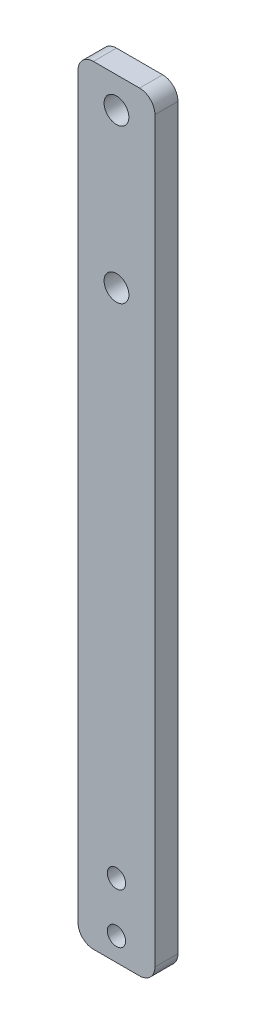
ISO-10303-21;
HEADER;
FILE_DESCRIPTION(('STEP AP214'),'2;1');
FILE_NAME('part.step','',(''),(''),'','','');
FILE_SCHEMA(('AUTOMOTIVE_DESIGN { 1 0 10303 214 1 1 1 1 }'));
ENDSEC;
DATA;
#1=APPLICATION_CONTEXT('core data for automotive mechanical design processes');
#2=APPLICATION_PROTOCOL_DEFINITION('international standard','automotive_design',2000,#1);
#3=PRODUCT_CONTEXT('',#1,'mechanical');
#4=PRODUCT('Part','Part','',(#3));
#5=PRODUCT_RELATED_PRODUCT_CATEGORY('part','',(#4));
#6=PRODUCT_DEFINITION_FORMATION('','',#4);
#7=PRODUCT_DEFINITION_CONTEXT('part definition',#1,'design');
#8=PRODUCT_DEFINITION('design','',#6,#7);
#9=PRODUCT_DEFINITION_SHAPE('','',#8);
#10=(LENGTH_UNIT() NAMED_UNIT(*) SI_UNIT(.MILLI.,.METRE.));
#11=(NAMED_UNIT(*) PLANE_ANGLE_UNIT() SI_UNIT($,.RADIAN.));
#12=(NAMED_UNIT(*) SI_UNIT($,.STERADIAN.) SOLID_ANGLE_UNIT());
#13=UNCERTAINTY_MEASURE_WITH_UNIT(LENGTH_MEASURE(1.E-05),#10,'distance_accuracy_value','');
#14=(GEOMETRIC_REPRESENTATION_CONTEXT(3) GLOBAL_UNCERTAINTY_ASSIGNED_CONTEXT((#13)) GLOBAL_UNIT_ASSIGNED_CONTEXT((#10,
#11,#12)) REPRESENTATION_CONTEXT('',''));
#15=CARTESIAN_POINT('',(0.,0.,0.));
#16=DIRECTION('',(0.,0.,1.));
#17=DIRECTION('',(1.,0.,0.));
#18=AXIS2_PLACEMENT_3D('',#15,#16,#17);
#19=CARTESIAN_POINT('',(0.,0.,1.5));
#20=DIRECTION('',(0.,0.,1.));
#21=DIRECTION('',(1.,0.,0.));
#22=AXIS2_PLACEMENT_3D('',#19,#20,#21);
#23=PLANE('',#22);
#24=CARTESIAN_POINT('',(0.,44.875,1.5));
#25=DIRECTION('',(0.,0.,1.));
#26=DIRECTION('',(1.,0.,0.));
#27=AXIS2_PLACEMENT_3D('',#24,#25,#26);
#28=CIRCLE('',#27,0.806449999999999);
#29=CARTESIAN_POINT('',(0.806449999999999,44.875,1.5));
#30=VERTEX_POINT('',#29);
#31=EDGE_CURVE('E194',#30,#30,#28,.T.);
#32=ORIENTED_EDGE('',*,*,#31,.F.);
#33=EDGE_LOOP('',(#32));
#34=FACE_BOUND('',#33,.T.);
#35=CARTESIAN_POINT('',(0.,1.625,1.5));
#36=DIRECTION('',(0.,0.,1.));
#37=DIRECTION('',(1.,0.,0.));
#38=AXIS2_PLACEMENT_3D('',#35,#36,#37);
#39=CIRCLE('',#38,0.59563);
#40=CARTESIAN_POINT('',(0.595629999999999,1.625,1.5));
#41=VERTEX_POINT('',#40);
#42=EDGE_CURVE('E180',#41,#41,#39,.T.);
#43=ORIENTED_EDGE('',*,*,#42,.F.);
#44=EDGE_LOOP('',(#43));
#45=FACE_BOUND('',#44,.T.);
#46=DIRECTION('',(-1.,0.,0.));
#47=VECTOR('',#46,1.);
#48=CARTESIAN_POINT('',(2.5,46.875,1.5));
#49=LINE('',#48,#47);
#50=CARTESIAN_POINT('',(1.5,46.875,1.5));
#51=VERTEX_POINT('',#50);
#52=CARTESIAN_POINT('',(-1.5,46.875,1.5));
#53=VERTEX_POINT('',#52);
#54=EDGE_CURVE('E174',#51,#53,#49,.T.);
#55=ORIENTED_EDGE('',*,*,#54,.T.);
#56=CARTESIAN_POINT('',(-1.5,45.875,1.5));
#57=DIRECTION('',(0.,0.,1.));
#58=DIRECTION('',(1.,0.,0.));
#59=AXIS2_PLACEMENT_3D('',#56,#57,#58);
#60=CIRCLE('',#59,1.);
#61=CARTESIAN_POINT('',(-2.5,45.875,1.5));
#62=VERTEX_POINT('',#61);
#63=EDGE_CURVE('E154',#53,#62,#60,.T.);
#64=ORIENTED_EDGE('',*,*,#63,.T.);
#65=DIRECTION('',(0.,-1.,0.));
#66=VECTOR('',#65,1.);
#67=CARTESIAN_POINT('',(-2.5,-3.125,1.5));
#68=LINE('',#67,#66);
#69=CARTESIAN_POINT('',(-2.5,-2.125,1.5));
#70=VERTEX_POINT('',#69);
#71=EDGE_CURVE('E124',#62,#70,#68,.T.);
#72=ORIENTED_EDGE('',*,*,#71,.T.);
#73=CARTESIAN_POINT('',(-1.5,-2.125,1.5));
#74=DIRECTION('',(0.,0.,1.));
#75=DIRECTION('',(1.,0.,0.));
#76=AXIS2_PLACEMENT_3D('',#73,#74,#75);
#77=CIRCLE('',#76,1.);
#78=CARTESIAN_POINT('',(-1.5,-3.125,1.5));
#79=VERTEX_POINT('',#78);
#80=EDGE_CURVE('E60',#70,#79,#77,.T.);
#81=ORIENTED_EDGE('',*,*,#80,.T.);
#82=DIRECTION('',(1.,0.,0.));
#83=VECTOR('',#82,1.);
#84=CARTESIAN_POINT('',(2.5,-3.125,1.5));
#85=LINE('',#84,#83);
#86=CARTESIAN_POINT('',(1.5,-3.125,1.5));
#87=VERTEX_POINT('',#86);
#88=EDGE_CURVE('E141',#79,#87,#85,.T.);
#89=ORIENTED_EDGE('',*,*,#88,.T.);
#90=CARTESIAN_POINT('',(1.5,-2.125,1.5));
#91=DIRECTION('',(0.,0.,1.));
#92=DIRECTION('',(1.,0.,0.));
#93=AXIS2_PLACEMENT_3D('',#90,#91,#92);
#94=CIRCLE('',#93,1.);
#95=CARTESIAN_POINT('',(2.5,-2.125,1.5));
#96=VERTEX_POINT('',#95);
#97=EDGE_CURVE('E149',#87,#96,#94,.T.);
#98=ORIENTED_EDGE('',*,*,#97,.T.);
#99=DIRECTION('',(0.,1.,0.));
#100=VECTOR('',#99,1.);
#101=CARTESIAN_POINT('',(2.5,-3.125,1.5));
#102=LINE('',#101,#100);
#103=CARTESIAN_POINT('',(2.5,45.875,1.5));
#104=VERTEX_POINT('',#103);
#105=EDGE_CURVE('E135',#96,#104,#102,.T.);
#106=ORIENTED_EDGE('',*,*,#105,.T.);
#107=CARTESIAN_POINT('',(1.5,45.875,1.5));
#108=DIRECTION('',(0.,0.,1.));
#109=DIRECTION('',(1.,0.,0.));
#110=AXIS2_PLACEMENT_3D('',#107,#108,#109);
#111=CIRCLE('',#110,1.);
#112=EDGE_CURVE('E152',#104,#51,#111,.T.);
#113=ORIENTED_EDGE('',*,*,#112,.T.);
#114=EDGE_LOOP('',(#55,#64,#72,#81,#89,#98,#106,#113));
#115=FACE_BOUND('',#114,.T.);
#116=CARTESIAN_POINT('',(0.,-1.625,1.5));
#117=DIRECTION('',(0.,0.,1.));
#118=DIRECTION('',(1.,0.,0.));
#119=AXIS2_PLACEMENT_3D('',#116,#117,#118);
#120=CIRCLE('',#119,0.59563);
#121=CARTESIAN_POINT('',(0.59563,-1.625,1.5));
#122=VERTEX_POINT('',#121);
#123=EDGE_CURVE('E189',#122,#122,#120,.T.);
#124=ORIENTED_EDGE('',*,*,#123,.F.);
#125=EDGE_LOOP('',(#124));
#126=FACE_BOUND('',#125,.T.);
#127=CARTESIAN_POINT('',(0.,34.875,1.5));
#128=DIRECTION('',(0.,0.,1.));
#129=DIRECTION('',(1.,0.,0.));
#130=AXIS2_PLACEMENT_3D('',#127,#128,#129);
#131=CIRCLE('',#130,0.80645);
#132=CARTESIAN_POINT('',(0.80645,34.875,1.5));
#133=VERTEX_POINT('',#132);
#134=EDGE_CURVE('E200',#133,#133,#131,.T.);
#135=ORIENTED_EDGE('',*,*,#134,.F.);
#136=EDGE_LOOP('',(#135));
#137=FACE_BOUND('',#136,.T.);
#138=ADVANCED_FACE('F39',(#34,#45,#115,#126,#137),#23,.T.);
#139=CARTESIAN_POINT('',(0.,0.,0.));
#140=DIRECTION('',(0.,0.,1.));
#141=DIRECTION('',(1.,0.,0.));
#142=AXIS2_PLACEMENT_3D('',#139,#140,#141);
#143=PLANE('',#142);
#144=DIRECTION('',(0.,-1.,0.));
#145=VECTOR('',#144,1.);
#146=CARTESIAN_POINT('',(-2.5,-3.125,0.));
#147=LINE('',#146,#145);
#148=CARTESIAN_POINT('',(-2.5,45.875,0.));
#149=VERTEX_POINT('',#148);
#150=CARTESIAN_POINT('',(-2.5,-2.125,0.));
#151=VERTEX_POINT('',#150);
#152=EDGE_CURVE('E122',#149,#151,#147,.T.);
#153=ORIENTED_EDGE('',*,*,#152,.F.);
#154=CARTESIAN_POINT('',(-1.5,45.875,0.));
#155=DIRECTION('',(0.,0.,1.));
#156=DIRECTION('',(1.,0.,0.));
#157=AXIS2_PLACEMENT_3D('',#154,#155,#156);
#158=CIRCLE('',#157,1.);
#159=CARTESIAN_POINT('',(-1.5,46.875,0.));
#160=VERTEX_POINT('',#159);
#161=EDGE_CURVE('E105',#149,#160,#158,.F.);
#162=ORIENTED_EDGE('',*,*,#161,.T.);
#163=DIRECTION('',(-1.,0.,0.));
#164=VECTOR('',#163,1.);
#165=CARTESIAN_POINT('',(2.5,46.875,0.));
#166=LINE('',#165,#164);
#167=CARTESIAN_POINT('',(1.5,46.875,0.));
#168=VERTEX_POINT('',#167);
#169=EDGE_CURVE('E133',#168,#160,#166,.T.);
#170=ORIENTED_EDGE('',*,*,#169,.F.);
#171=CARTESIAN_POINT('',(1.5,45.875,0.));
#172=DIRECTION('',(0.,0.,1.));
#173=DIRECTION('',(1.,0.,0.));
#174=AXIS2_PLACEMENT_3D('',#171,#172,#173);
#175=CIRCLE('',#174,1.);
#176=CARTESIAN_POINT('',(2.5,45.875,0.));
#177=VERTEX_POINT('',#176);
#178=EDGE_CURVE('E116',#168,#177,#175,.F.);
#179=ORIENTED_EDGE('',*,*,#178,.T.);
#180=DIRECTION('',(0.,1.,0.));
#181=VECTOR('',#180,1.);
#182=CARTESIAN_POINT('',(2.5,-3.125,0.));
#183=LINE('',#182,#181);
#184=CARTESIAN_POINT('',(2.5,-2.125,0.));
#185=VERTEX_POINT('',#184);
#186=EDGE_CURVE('E137',#185,#177,#183,.T.);
#187=ORIENTED_EDGE('',*,*,#186,.F.);
#188=CARTESIAN_POINT('',(1.5,-2.125,0.));
#189=DIRECTION('',(0.,0.,1.));
#190=DIRECTION('',(1.,0.,0.));
#191=AXIS2_PLACEMENT_3D('',#188,#189,#190);
#192=CIRCLE('',#191,1.);
#193=CARTESIAN_POINT('',(1.5,-3.125,0.));
#194=VERTEX_POINT('',#193);
#195=EDGE_CURVE('E125',#185,#194,#192,.F.);
#196=ORIENTED_EDGE('',*,*,#195,.T.);
#197=DIRECTION('',(1.,0.,0.));
#198=VECTOR('',#197,1.);
#199=CARTESIAN_POINT('',(2.5,-3.125,0.));
#200=LINE('',#199,#198);
#201=CARTESIAN_POINT('',(-1.5,-3.125,0.));
#202=VERTEX_POINT('',#201);
#203=EDGE_CURVE('E132',#202,#194,#200,.T.);
#204=ORIENTED_EDGE('',*,*,#203,.F.);
#205=CARTESIAN_POINT('',(-1.5,-2.125,0.));
#206=DIRECTION('',(0.,0.,1.));
#207=DIRECTION('',(1.,0.,0.));
#208=AXIS2_PLACEMENT_3D('',#205,#206,#207);
#209=CIRCLE('',#208,1.);
#210=EDGE_CURVE('E131',#202,#151,#209,.F.);
#211=ORIENTED_EDGE('',*,*,#210,.T.);
#212=EDGE_LOOP('',(#153,#162,#170,#179,#187,#196,#204,#211));
#213=FACE_BOUND('',#212,.T.);
#214=CARTESIAN_POINT('',(0.,1.625,0.));
#215=DIRECTION('',(0.,0.,1.));
#216=DIRECTION('',(1.,0.,0.));
#217=AXIS2_PLACEMENT_3D('',#214,#215,#216);
#218=CIRCLE('',#217,0.59563);
#219=CARTESIAN_POINT('',(0.595629999999999,1.625,0.));
#220=VERTEX_POINT('',#219);
#221=EDGE_CURVE('E182',#220,#220,#218,.T.);
#222=ORIENTED_EDGE('',*,*,#221,.T.);
#223=EDGE_LOOP('',(#222));
#224=FACE_BOUND('',#223,.T.);
#225=CARTESIAN_POINT('',(0.,-1.625,0.));
#226=DIRECTION('',(0.,0.,1.));
#227=DIRECTION('',(1.,0.,0.));
#228=AXIS2_PLACEMENT_3D('',#225,#226,#227);
#229=CIRCLE('',#228,0.59563);
#230=CARTESIAN_POINT('',(0.59563,-1.625,0.));
#231=VERTEX_POINT('',#230);
#232=EDGE_CURVE('E191',#231,#231,#229,.T.);
#233=ORIENTED_EDGE('',*,*,#232,.T.);
#234=EDGE_LOOP('',(#233));
#235=FACE_BOUND('',#234,.T.);
#236=CARTESIAN_POINT('',(0.,44.875,0.));
#237=DIRECTION('',(0.,0.,1.));
#238=DIRECTION('',(1.,0.,0.));
#239=AXIS2_PLACEMENT_3D('',#236,#237,#238);
#240=CIRCLE('',#239,0.806449999999999);
#241=CARTESIAN_POINT('',(0.806449999999999,44.875,0.));
#242=VERTEX_POINT('',#241);
#243=EDGE_CURVE('E197',#242,#242,#240,.T.);
#244=ORIENTED_EDGE('',*,*,#243,.T.);
#245=EDGE_LOOP('',(#244));
#246=FACE_BOUND('',#245,.T.);
#247=CARTESIAN_POINT('',(0.,34.875,0.));
#248=DIRECTION('',(0.,0.,1.));
#249=DIRECTION('',(1.,0.,0.));
#250=AXIS2_PLACEMENT_3D('',#247,#248,#249);
#251=CIRCLE('',#250,0.80645);
#252=CARTESIAN_POINT('',(0.80645,34.875,0.));
#253=VERTEX_POINT('',#252);
#254=EDGE_CURVE('E203',#253,#253,#251,.T.);
#255=ORIENTED_EDGE('',*,*,#254,.T.);
#256=EDGE_LOOP('',(#255));
#257=FACE_BOUND('',#256,.T.);
#258=ADVANCED_FACE('F128',(#213,#224,#235,#246,#257),#143,.F.);
#259=CARTESIAN_POINT('',(2.5,-3.125,1.5));
#260=DIRECTION('',(-1.,0.,0.));
#261=DIRECTION('',(0.,0.,1.));
#262=AXIS2_PLACEMENT_3D('',#259,#260,#261);
#263=PLANE('',#262);
#264=ORIENTED_EDGE('',*,*,#186,.T.);
#265=DIRECTION('',(0.,0.,-1.));
#266=VECTOR('',#265,1.);
#267=CARTESIAN_POINT('',(2.5,45.875,1.5));
#268=LINE('',#267,#266);
#269=EDGE_CURVE('E159',#177,#104,#268,.F.);
#270=ORIENTED_EDGE('',*,*,#269,.T.);
#271=ORIENTED_EDGE('',*,*,#105,.F.);
#272=DIRECTION('',(0.,0.,-1.));
#273=VECTOR('',#272,1.);
#274=CARTESIAN_POINT('',(2.5,-2.125,1.5));
#275=LINE('',#274,#273);
#276=EDGE_CURVE('E156',#96,#185,#275,.T.);
#277=ORIENTED_EDGE('',*,*,#276,.T.);
#278=EDGE_LOOP('',(#264,#270,#271,#277));
#279=FACE_BOUND('',#278,.T.);
#280=ADVANCED_FACE('F165',(#279),#263,.F.);
#281=CARTESIAN_POINT('',(2.5,46.875,1.5));
#282=DIRECTION('',(0.,-1.,0.));
#283=DIRECTION('',(0.,0.,-1.));
#284=AXIS2_PLACEMENT_3D('',#281,#282,#283);
#285=PLANE('',#284);
#286=ORIENTED_EDGE('',*,*,#169,.T.);
#287=DIRECTION('',(0.,0.,-1.));
#288=VECTOR('',#287,1.);
#289=CARTESIAN_POINT('',(-1.5,46.875,1.5));
#290=LINE('',#289,#288);
#291=EDGE_CURVE('E110',#160,#53,#290,.F.);
#292=ORIENTED_EDGE('',*,*,#291,.T.);
#293=ORIENTED_EDGE('',*,*,#54,.F.);
#294=DIRECTION('',(0.,0.,-1.));
#295=VECTOR('',#294,1.);
#296=CARTESIAN_POINT('',(1.5,46.875,1.5));
#297=LINE('',#296,#295);
#298=EDGE_CURVE('E115',#51,#168,#297,.T.);
#299=ORIENTED_EDGE('',*,*,#298,.T.);
#300=EDGE_LOOP('',(#286,#292,#293,#299));
#301=FACE_BOUND('',#300,.T.);
#302=ADVANCED_FACE('F179',(#301),#285,.F.);
#303=CARTESIAN_POINT('',(-2.5,-3.125,1.5));
#304=DIRECTION('',(1.,0.,0.));
#305=DIRECTION('',(0.,0.,-1.));
#306=AXIS2_PLACEMENT_3D('',#303,#304,#305);
#307=PLANE('',#306);
#308=ORIENTED_EDGE('',*,*,#71,.F.);
#309=DIRECTION('',(0.,0.,-1.));
#310=VECTOR('',#309,1.);
#311=CARTESIAN_POINT('',(-2.5,45.875,1.5));
#312=LINE('',#311,#310);
#313=EDGE_CURVE('E109',#62,#149,#312,.T.);
#314=ORIENTED_EDGE('',*,*,#313,.T.);
#315=ORIENTED_EDGE('',*,*,#152,.T.);
#316=DIRECTION('',(0.,0.,-1.));
#317=VECTOR('',#316,1.);
#318=CARTESIAN_POINT('',(-2.5,-2.125,1.5));
#319=LINE('',#318,#317);
#320=EDGE_CURVE('E126',#151,#70,#319,.F.);
#321=ORIENTED_EDGE('',*,*,#320,.T.);
#322=EDGE_LOOP('',(#308,#314,#315,#321));
#323=FACE_BOUND('',#322,.T.);
#324=ADVANCED_FACE('F121',(#323),#307,.F.);
#325=CARTESIAN_POINT('',(2.5,-3.125,1.5));
#326=DIRECTION('',(0.,1.,0.));
#327=DIRECTION('',(0.,0.,1.));
#328=AXIS2_PLACEMENT_3D('',#325,#326,#327);
#329=PLANE('',#328);
#330=ORIENTED_EDGE('',*,*,#88,.F.);
#331=DIRECTION('',(0.,0.,-1.));
#332=VECTOR('',#331,1.);
#333=CARTESIAN_POINT('',(-1.5,-3.125,1.5));
#334=LINE('',#333,#332);
#335=EDGE_CURVE('E11',#79,#202,#334,.T.);
#336=ORIENTED_EDGE('',*,*,#335,.T.);
#337=ORIENTED_EDGE('',*,*,#203,.T.);
#338=DIRECTION('',(0.,0.,-1.));
#339=VECTOR('',#338,1.);
#340=CARTESIAN_POINT('',(1.5,-3.125,1.5));
#341=LINE('',#340,#339);
#342=EDGE_CURVE('E47',#194,#87,#341,.F.);
#343=ORIENTED_EDGE('',*,*,#342,.T.);
#344=EDGE_LOOP('',(#330,#336,#337,#343));
#345=FACE_BOUND('',#344,.T.);
#346=ADVANCED_FACE('F226',(#345),#329,.F.);
#347=CARTESIAN_POINT('',(0.,1.625,1.5));
#348=DIRECTION('',(0.,0.,-1.));
#349=DIRECTION('',(-1.,0.,0.));
#350=AXIS2_PLACEMENT_3D('',#347,#348,#349);
#351=CYLINDRICAL_SURFACE('',#350,0.59563);
#352=ORIENTED_EDGE('',*,*,#42,.T.);
#353=EDGE_LOOP('',(#352));
#354=FACE_BOUND('',#353,.T.);
#355=ORIENTED_EDGE('',*,*,#221,.F.);
#356=EDGE_LOOP('',(#355));
#357=FACE_BOUND('',#356,.T.);
#358=ADVANCED_FACE('F223',(#354,#357),#351,.F.);
#359=CARTESIAN_POINT('',(0.,-1.625,1.5));
#360=DIRECTION('',(0.,0.,-1.));
#361=DIRECTION('',(-1.,0.,0.));
#362=AXIS2_PLACEMENT_3D('',#359,#360,#361);
#363=CYLINDRICAL_SURFACE('',#362,0.59563);
#364=ORIENTED_EDGE('',*,*,#123,.T.);
#365=EDGE_LOOP('',(#364));
#366=FACE_BOUND('',#365,.T.);
#367=ORIENTED_EDGE('',*,*,#232,.F.);
#368=EDGE_LOOP('',(#367));
#369=FACE_BOUND('',#368,.T.);
#370=ADVANCED_FACE('F282',(#366,#369),#363,.F.);
#371=CARTESIAN_POINT('',(0.,44.875,1.5));
#372=DIRECTION('',(0.,0.,-1.));
#373=DIRECTION('',(-1.,0.,0.));
#374=AXIS2_PLACEMENT_3D('',#371,#372,#373);
#375=CYLINDRICAL_SURFACE('',#374,0.806449999999999);
#376=ORIENTED_EDGE('',*,*,#31,.T.);
#377=EDGE_LOOP('',(#376));
#378=FACE_BOUND('',#377,.T.);
#379=ORIENTED_EDGE('',*,*,#243,.F.);
#380=EDGE_LOOP('',(#379));
#381=FACE_BOUND('',#380,.T.);
#382=ADVANCED_FACE('F273',(#378,#381),#375,.F.);
#383=CARTESIAN_POINT('',(0.,34.875,1.5));
#384=DIRECTION('',(0.,0.,-1.));
#385=DIRECTION('',(-1.,0.,0.));
#386=AXIS2_PLACEMENT_3D('',#383,#384,#385);
#387=CYLINDRICAL_SURFACE('',#386,0.80645);
#388=ORIENTED_EDGE('',*,*,#134,.T.);
#389=EDGE_LOOP('',(#388));
#390=FACE_BOUND('',#389,.T.);
#391=ORIENTED_EDGE('',*,*,#254,.F.);
#392=EDGE_LOOP('',(#391));
#393=FACE_BOUND('',#392,.T.);
#394=ADVANCED_FACE('F209',(#390,#393),#387,.F.);
#395=CARTESIAN_POINT('',(-1.5,45.875,1.5));
#396=DIRECTION('',(0.,0.,-1.));
#397=DIRECTION('',(-1.,0.,0.));
#398=AXIS2_PLACEMENT_3D('',#395,#396,#397);
#399=CYLINDRICAL_SURFACE('',#398,1.);
#400=ORIENTED_EDGE('',*,*,#63,.F.);
#401=ORIENTED_EDGE('',*,*,#291,.F.);
#402=ORIENTED_EDGE('',*,*,#161,.F.);
#403=ORIENTED_EDGE('',*,*,#313,.F.);
#404=EDGE_LOOP('',(#400,#401,#402,#403));
#405=FACE_BOUND('',#404,.T.);
#406=ADVANCED_FACE('F108',(#405),#399,.T.);
#407=CARTESIAN_POINT('',(1.5,45.875,1.5));
#408=DIRECTION('',(0.,0.,-1.));
#409=DIRECTION('',(-1.,0.,0.));
#410=AXIS2_PLACEMENT_3D('',#407,#408,#409);
#411=CYLINDRICAL_SURFACE('',#410,1.);
#412=ORIENTED_EDGE('',*,*,#112,.F.);
#413=ORIENTED_EDGE('',*,*,#269,.F.);
#414=ORIENTED_EDGE('',*,*,#178,.F.);
#415=ORIENTED_EDGE('',*,*,#298,.F.);
#416=EDGE_LOOP('',(#412,#413,#414,#415));
#417=FACE_BOUND('',#416,.T.);
#418=ADVANCED_FACE('F177',(#417),#411,.T.);
#419=CARTESIAN_POINT('',(-1.5,-2.125,1.5));
#420=DIRECTION('',(0.,0.,-1.));
#421=DIRECTION('',(-1.,0.,0.));
#422=AXIS2_PLACEMENT_3D('',#419,#420,#421);
#423=CYLINDRICAL_SURFACE('',#422,1.);
#424=ORIENTED_EDGE('',*,*,#80,.F.);
#425=ORIENTED_EDGE('',*,*,#320,.F.);
#426=ORIENTED_EDGE('',*,*,#210,.F.);
#427=ORIENTED_EDGE('',*,*,#335,.F.);
#428=EDGE_LOOP('',(#424,#425,#426,#427));
#429=FACE_BOUND('',#428,.T.);
#430=ADVANCED_FACE('F238',(#429),#423,.T.);
#431=CARTESIAN_POINT('',(1.5,-2.125,1.5));
#432=DIRECTION('',(0.,0.,-1.));
#433=DIRECTION('',(-1.,0.,0.));
#434=AXIS2_PLACEMENT_3D('',#431,#432,#433);
#435=CYLINDRICAL_SURFACE('',#434,1.);
#436=ORIENTED_EDGE('',*,*,#97,.F.);
#437=ORIENTED_EDGE('',*,*,#342,.F.);
#438=ORIENTED_EDGE('',*,*,#195,.F.);
#439=ORIENTED_EDGE('',*,*,#276,.F.);
#440=EDGE_LOOP('',(#436,#437,#438,#439));
#441=FACE_BOUND('',#440,.T.);
#442=ADVANCED_FACE('F41',(#441),#435,.T.);
#443=CLOSED_SHELL('',(#138,#258,#280,#302,#324,#346,#358,#370,#382,#394,#406,#418,#430,#442));
#444=MANIFOLD_SOLID_BREP('B2',#443);
#445=ADVANCED_BREP_SHAPE_REPRESENTATION('',(#18,#444),#14);
#446=SHAPE_DEFINITION_REPRESENTATION(#9,#445);
ENDSEC;
END-ISO-10303-21;
